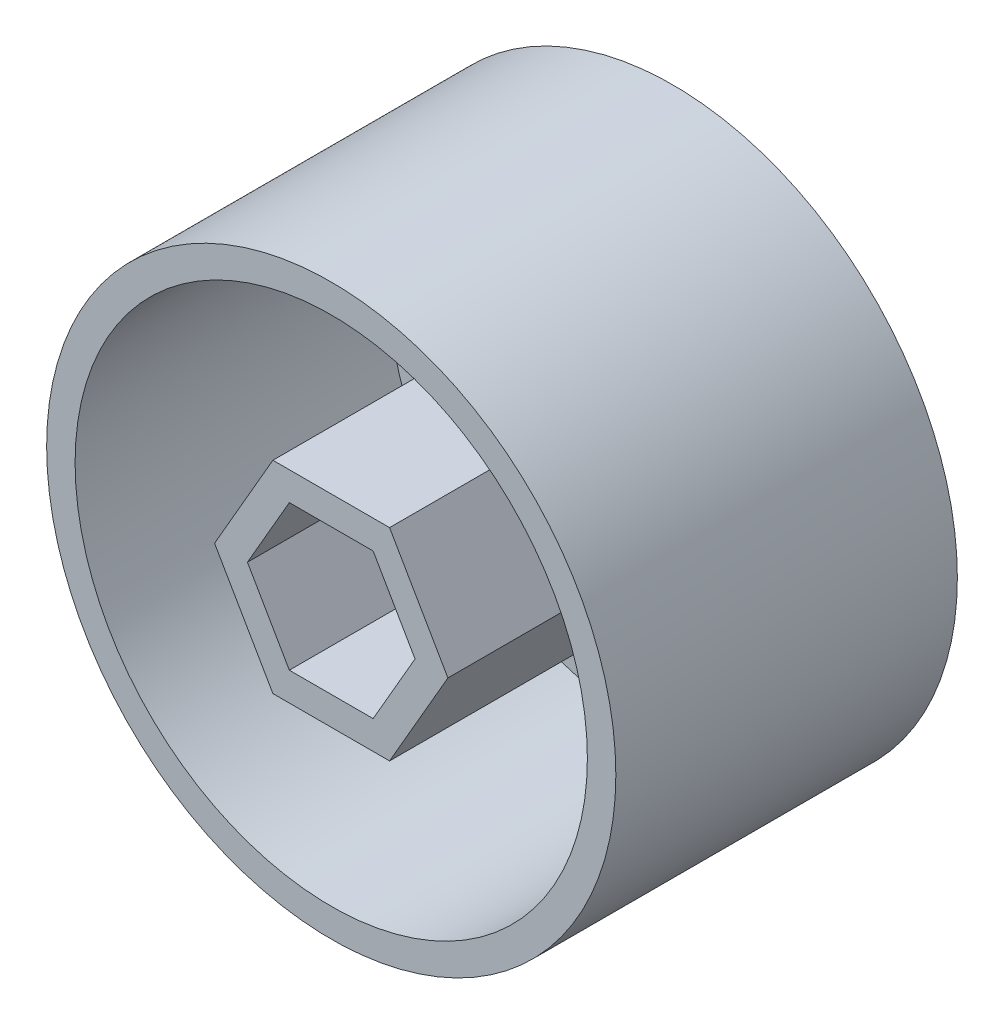
ISO-10303-21;
HEADER;
FILE_DESCRIPTION(('STEP AP214'),'2;1');
FILE_NAME('part.step','',(''),(''),'','','');
FILE_SCHEMA(('AUTOMOTIVE_DESIGN { 1 0 10303 214 1 1 1 1 }'));
ENDSEC;
DATA;
#1=APPLICATION_CONTEXT('core data for automotive mechanical design processes');
#2=APPLICATION_PROTOCOL_DEFINITION('international standard','automotive_design',2000,#1);
#3=PRODUCT_CONTEXT('',#1,'mechanical');
#4=PRODUCT('Part','Part','',(#3));
#5=PRODUCT_RELATED_PRODUCT_CATEGORY('part','',(#4));
#6=PRODUCT_DEFINITION_FORMATION('','',#4);
#7=PRODUCT_DEFINITION_CONTEXT('part definition',#1,'design');
#8=PRODUCT_DEFINITION('design','',#6,#7);
#9=PRODUCT_DEFINITION_SHAPE('','',#8);
#10=(LENGTH_UNIT() NAMED_UNIT(*) SI_UNIT(.MILLI.,.METRE.));
#11=(NAMED_UNIT(*) PLANE_ANGLE_UNIT() SI_UNIT($,.RADIAN.));
#12=(NAMED_UNIT(*) SI_UNIT($,.STERADIAN.) SOLID_ANGLE_UNIT());
#13=UNCERTAINTY_MEASURE_WITH_UNIT(LENGTH_MEASURE(1.E-05),#10,'distance_accuracy_value','');
#14=(GEOMETRIC_REPRESENTATION_CONTEXT(3) GLOBAL_UNCERTAINTY_ASSIGNED_CONTEXT((#13)) GLOBAL_UNIT_ASSIGNED_CONTEXT((#10,
#11,#12)) REPRESENTATION_CONTEXT('',''));
#15=CARTESIAN_POINT('',(0.,0.,0.));
#16=DIRECTION('',(0.,0.,1.));
#17=DIRECTION('',(1.,0.,0.));
#18=AXIS2_PLACEMENT_3D('',#15,#16,#17);
#19=CARTESIAN_POINT('',(0.,0.,2.));
#20=DIRECTION('',(0.,0.,-1.));
#21=DIRECTION('',(-1.,0.,0.));
#22=AXIS2_PLACEMENT_3D('',#19,#20,#21);
#23=PLANE('',#22);
#24=CARTESIAN_POINT('',(0.,0.,2.));
#25=DIRECTION('',(0.,0.,-1.));
#26=DIRECTION('',(-1.,0.,0.));
#27=AXIS2_PLACEMENT_3D('',#24,#25,#26);
#28=CIRCLE('',#27,18.);
#29=CARTESIAN_POINT('',(-18.,0.,2.));
#30=VERTEX_POINT('',#29);
#31=EDGE_CURVE('E231',#30,#30,#28,.T.);
#32=ORIENTED_EDGE('',*,*,#31,.F.);
#33=EDGE_LOOP('',(#32));
#34=FACE_BOUND('',#33,.T.);
#35=DIRECTION('',(0.5,0.866025403784439,0.));
#36=VECTOR('',#35,1.);
#37=CARTESIAN_POINT('',(6.14878036686952,-3.55,2.));
#38=LINE('',#37,#36);
#39=CARTESIAN_POINT('',(4.09918691124635,-7.1,2.));
#40=VERTEX_POINT('',#39);
#41=CARTESIAN_POINT('',(8.19837382249269,0.,2.));
#42=VERTEX_POINT('',#41);
#43=EDGE_CURVE('E12',#40,#42,#38,.T.);
#44=ORIENTED_EDGE('',*,*,#43,.F.);
#45=DIRECTION('',(1.,0.,0.));
#46=VECTOR('',#45,1.);
#47=CARTESIAN_POINT('',(0.,-7.1,2.));
#48=LINE('',#47,#46);
#49=CARTESIAN_POINT('',(-4.09918691124634,-7.1,2.));
#50=VERTEX_POINT('',#49);
#51=EDGE_CURVE('E247',#50,#40,#48,.T.);
#52=ORIENTED_EDGE('',*,*,#51,.F.);
#53=DIRECTION('',(0.5,-0.866025403784439,0.));
#54=VECTOR('',#53,1.);
#55=CARTESIAN_POINT('',(-6.14878036686951,-3.55,2.));
#56=LINE('',#55,#54);
#57=CARTESIAN_POINT('',(-8.19837382249269,0.,2.));
#58=VERTEX_POINT('',#57);
#59=EDGE_CURVE('E252',#58,#50,#56,.T.);
#60=ORIENTED_EDGE('',*,*,#59,.F.);
#61=DIRECTION('',(-0.5,-0.866025403784439,0.));
#62=VECTOR('',#61,1.);
#63=CARTESIAN_POINT('',(-6.14878036686951,3.55,2.));
#64=LINE('',#63,#62);
#65=CARTESIAN_POINT('',(-4.09918691124634,7.1,2.));
#66=VERTEX_POINT('',#65);
#67=EDGE_CURVE('E255',#66,#58,#64,.T.);
#68=ORIENTED_EDGE('',*,*,#67,.F.);
#69=DIRECTION('',(-1.,0.,0.));
#70=VECTOR('',#69,1.);
#71=CARTESIAN_POINT('',(0.,7.1,2.));
#72=LINE('',#71,#70);
#73=CARTESIAN_POINT('',(4.09918691124634,7.1,2.));
#74=VERTEX_POINT('',#73);
#75=EDGE_CURVE('E79',#74,#66,#72,.T.);
#76=ORIENTED_EDGE('',*,*,#75,.F.);
#77=DIRECTION('',(-0.5,0.866025403784439,0.));
#78=VECTOR('',#77,1.);
#79=CARTESIAN_POINT('',(6.14878036686951,3.55,2.));
#80=LINE('',#79,#78);
#81=EDGE_CURVE('E69',#42,#74,#80,.T.);
#82=ORIENTED_EDGE('',*,*,#81,.F.);
#83=EDGE_LOOP('',(#44,#52,#60,#68,#76,#82));
#84=FACE_BOUND('',#83,.T.);
#85=ADVANCED_FACE('F61',(#34,#84),#23,.F.);
#86=CARTESIAN_POINT('',(0.,0.,24.));
#87=DIRECTION('',(0.,0.,-1.));
#88=DIRECTION('',(-1.,0.,0.));
#89=AXIS2_PLACEMENT_3D('',#86,#87,#88);
#90=CYLINDRICAL_SURFACE('',#89,18.);
#91=CARTESIAN_POINT('',(0.,0.,24.));
#92=DIRECTION('',(0.,0.,1.));
#93=DIRECTION('',(1.,0.,0.));
#94=AXIS2_PLACEMENT_3D('',#91,#92,#93);
#95=CIRCLE('',#94,18.);
#96=CARTESIAN_POINT('',(18.,0.,24.));
#97=VERTEX_POINT('',#96);
#98=EDGE_CURVE('E241',#97,#97,#95,.T.);
#99=ORIENTED_EDGE('',*,*,#98,.T.);
#100=EDGE_LOOP('',(#99));
#101=FACE_BOUND('',#100,.T.);
#102=ORIENTED_EDGE('',*,*,#31,.T.);
#103=EDGE_LOOP('',(#102));
#104=FACE_BOUND('',#103,.T.);
#105=ADVANCED_FACE('F63',(#101,#104),#90,.F.);
#106=CARTESIAN_POINT('',(0.,0.,24.));
#107=DIRECTION('',(0.,0.,-1.));
#108=DIRECTION('',(-1.,0.,0.));
#109=AXIS2_PLACEMENT_3D('',#106,#107,#108);
#110=CYLINDRICAL_SURFACE('',#109,20.);
#111=CARTESIAN_POINT('',(0.,0.,0.));
#112=DIRECTION('',(0.,0.,1.));
#113=DIRECTION('',(1.,0.,0.));
#114=AXIS2_PLACEMENT_3D('',#111,#112,#113);
#115=CIRCLE('',#114,20.);
#116=CARTESIAN_POINT('',(20.,0.,0.));
#117=VERTEX_POINT('',#116);
#118=EDGE_CURVE('E240',#117,#117,#115,.T.);
#119=ORIENTED_EDGE('',*,*,#118,.T.);
#120=EDGE_LOOP('',(#119));
#121=FACE_BOUND('',#120,.T.);
#122=CARTESIAN_POINT('',(0.,0.,24.));
#123=DIRECTION('',(0.,0.,1.));
#124=DIRECTION('',(1.,0.,0.));
#125=AXIS2_PLACEMENT_3D('',#122,#123,#124);
#126=CIRCLE('',#125,20.);
#127=CARTESIAN_POINT('',(20.,0.,24.));
#128=VERTEX_POINT('',#127);
#129=EDGE_CURVE('E244',#128,#128,#126,.T.);
#130=ORIENTED_EDGE('',*,*,#129,.F.);
#131=EDGE_LOOP('',(#130));
#132=FACE_BOUND('',#131,.T.);
#133=ADVANCED_FACE('F295',(#121,#132),#110,.T.);
#134=CARTESIAN_POINT('',(0.,0.,24.));
#135=DIRECTION('',(0.,0.,1.));
#136=DIRECTION('',(1.,0.,0.));
#137=AXIS2_PLACEMENT_3D('',#134,#135,#136);
#138=PLANE('',#137);
#139=ORIENTED_EDGE('',*,*,#98,.F.);
#140=EDGE_LOOP('',(#139));
#141=FACE_BOUND('',#140,.T.);
#142=ORIENTED_EDGE('',*,*,#129,.T.);
#143=EDGE_LOOP('',(#142));
#144=FACE_BOUND('',#143,.T.);
#145=ADVANCED_FACE('F302',(#141,#144),#138,.T.);
#146=CARTESIAN_POINT('',(0.,0.,0.));
#147=DIRECTION('',(0.,0.,1.));
#148=DIRECTION('',(1.,0.,0.));
#149=AXIS2_PLACEMENT_3D('',#146,#147,#148);
#150=PLANE('',#149);
#151=DIRECTION('',(1.,0.,0.));
#152=VECTOR('',#151,1.);
#153=CARTESIAN_POINT('',(2.94448637286709,5.1,0.));
#154=LINE('',#153,#152);
#155=CARTESIAN_POINT('',(-2.94448637286709,5.1,0.));
#156=VERTEX_POINT('',#155);
#157=CARTESIAN_POINT('',(2.94448637286709,5.1,0.));
#158=VERTEX_POINT('',#157);
#159=EDGE_CURVE('E214',#156,#158,#154,.T.);
#160=ORIENTED_EDGE('',*,*,#159,.F.);
#161=DIRECTION('',(0.5,0.866025403784439,0.));
#162=VECTOR('',#161,1.);
#163=CARTESIAN_POINT('',(-2.94448637286709,5.1,0.));
#164=LINE('',#163,#162);
#165=CARTESIAN_POINT('',(-5.88897274573418,0.,0.));
#166=VERTEX_POINT('',#165);
#167=EDGE_CURVE('E225',#166,#156,#164,.T.);
#168=ORIENTED_EDGE('',*,*,#167,.F.);
#169=DIRECTION('',(-0.5,0.866025403784438,0.));
#170=VECTOR('',#169,1.);
#171=CARTESIAN_POINT('',(-5.88897274573418,0.,0.));
#172=LINE('',#171,#170);
#173=CARTESIAN_POINT('',(-2.94448637286709,-5.1,0.));
#174=VERTEX_POINT('',#173);
#175=EDGE_CURVE('E222',#174,#166,#172,.T.);
#176=ORIENTED_EDGE('',*,*,#175,.F.);
#177=DIRECTION('',(-1.,0.,0.));
#178=VECTOR('',#177,1.);
#179=CARTESIAN_POINT('',(-2.94448637286709,-5.1,0.));
#180=LINE('',#179,#178);
#181=CARTESIAN_POINT('',(2.94448637286709,-5.1,0.));
#182=VERTEX_POINT('',#181);
#183=EDGE_CURVE('E220',#182,#174,#180,.T.);
#184=ORIENTED_EDGE('',*,*,#183,.F.);
#185=DIRECTION('',(-0.5,-0.866025403784439,0.));
#186=VECTOR('',#185,1.);
#187=CARTESIAN_POINT('',(2.94448637286709,-5.1,0.));
#188=LINE('',#187,#186);
#189=CARTESIAN_POINT('',(5.88897274573418,0.,0.));
#190=VERTEX_POINT('',#189);
#191=EDGE_CURVE('E152',#190,#182,#188,.T.);
#192=ORIENTED_EDGE('',*,*,#191,.F.);
#193=DIRECTION('',(0.5,-0.866025403784438,0.));
#194=VECTOR('',#193,1.);
#195=CARTESIAN_POINT('',(5.88897274573418,0.,0.));
#196=LINE('',#195,#194);
#197=EDGE_CURVE('E216',#158,#190,#196,.T.);
#198=ORIENTED_EDGE('',*,*,#197,.F.);
#199=EDGE_LOOP('',(#160,#168,#176,#184,#192,#198));
#200=FACE_BOUND('',#199,.T.);
#201=ORIENTED_EDGE('',*,*,#118,.F.);
#202=EDGE_LOOP('',(#201));
#203=FACE_BOUND('',#202,.T.);
#204=ADVANCED_FACE('F305',(#200,#203),#150,.F.);
#205=CARTESIAN_POINT('',(2.94448637286709,5.1,2.));
#206=DIRECTION('',(0.,1.,0.));
#207=DIRECTION('',(0.,0.,1.));
#208=AXIS2_PLACEMENT_3D('',#205,#206,#207);
#209=PLANE('',#208);
#210=ORIENTED_EDGE('',*,*,#159,.T.);
#211=DIRECTION('',(0.,0.,-1.));
#212=VECTOR('',#211,1.);
#213=CARTESIAN_POINT('',(2.94448637286709,5.1,2.));
#214=LINE('',#213,#212);
#215=CARTESIAN_POINT('',(2.94448637286709,5.1,24.));
#216=VERTEX_POINT('',#215);
#217=EDGE_CURVE('E228',#216,#158,#214,.T.);
#218=ORIENTED_EDGE('',*,*,#217,.F.);
#219=DIRECTION('',(-1.,0.,0.));
#220=VECTOR('',#219,1.);
#221=CARTESIAN_POINT('',(0.,5.1,24.));
#222=LINE('',#221,#220);
#223=CARTESIAN_POINT('',(-2.94448637286709,5.1,24.));
#224=VERTEX_POINT('',#223);
#225=EDGE_CURVE('E179',#216,#224,#222,.T.);
#226=ORIENTED_EDGE('',*,*,#225,.T.);
#227=DIRECTION('',(0.,0.,-1.));
#228=VECTOR('',#227,1.);
#229=CARTESIAN_POINT('',(-2.94448637286709,5.1,2.));
#230=LINE('',#229,#228);
#231=EDGE_CURVE('E229',#224,#156,#230,.T.);
#232=ORIENTED_EDGE('',*,*,#231,.T.);
#233=EDGE_LOOP('',(#210,#218,#226,#232));
#234=FACE_BOUND('',#233,.T.);
#235=ADVANCED_FACE('F300',(#234),#209,.F.);
#236=CARTESIAN_POINT('',(-2.94448637286709,5.1,2.));
#237=DIRECTION('',(-0.866025403784439,0.5,0.));
#238=DIRECTION('',(-0.5,-0.866025403784439,0.));
#239=AXIS2_PLACEMENT_3D('',#236,#237,#238);
#240=PLANE('',#239);
#241=ORIENTED_EDGE('',*,*,#167,.T.);
#242=ORIENTED_EDGE('',*,*,#231,.F.);
#243=DIRECTION('',(-0.5,-0.866025403784439,0.));
#244=VECTOR('',#243,1.);
#245=CARTESIAN_POINT('',(-4.41672955930064,2.55,24.));
#246=LINE('',#245,#244);
#247=CARTESIAN_POINT('',(-5.88897274573418,0.,24.));
#248=VERTEX_POINT('',#247);
#249=EDGE_CURVE('E174',#224,#248,#246,.T.);
#250=ORIENTED_EDGE('',*,*,#249,.T.);
#251=DIRECTION('',(0.,0.,-1.));
#252=VECTOR('',#251,1.);
#253=CARTESIAN_POINT('',(-5.88897274573418,0.,2.));
#254=LINE('',#253,#252);
#255=EDGE_CURVE('E232',#248,#166,#254,.T.);
#256=ORIENTED_EDGE('',*,*,#255,.T.);
#257=EDGE_LOOP('',(#241,#242,#250,#256));
#258=FACE_BOUND('',#257,.T.);
#259=ADVANCED_FACE('F334',(#258),#240,.F.);
#260=CARTESIAN_POINT('',(-5.88897274573418,0.,2.));
#261=DIRECTION('',(-0.866025403784438,-0.5,0.));
#262=DIRECTION('',(0.5,-0.866025403784438,0.));
#263=AXIS2_PLACEMENT_3D('',#260,#261,#262);
#264=PLANE('',#263);
#265=ORIENTED_EDGE('',*,*,#175,.T.);
#266=ORIENTED_EDGE('',*,*,#255,.F.);
#267=DIRECTION('',(0.5,-0.866025403784439,0.));
#268=VECTOR('',#267,1.);
#269=CARTESIAN_POINT('',(-4.41672955930063,-2.55,24.));
#270=LINE('',#269,#268);
#271=CARTESIAN_POINT('',(-2.94448637286709,-5.1,24.));
#272=VERTEX_POINT('',#271);
#273=EDGE_CURVE('E172',#248,#272,#270,.T.);
#274=ORIENTED_EDGE('',*,*,#273,.T.);
#275=DIRECTION('',(0.,0.,-1.));
#276=VECTOR('',#275,1.);
#277=CARTESIAN_POINT('',(-2.94448637286709,-5.1,2.));
#278=LINE('',#277,#276);
#279=EDGE_CURVE('E157',#272,#174,#278,.T.);
#280=ORIENTED_EDGE('',*,*,#279,.T.);
#281=EDGE_LOOP('',(#265,#266,#274,#280));
#282=FACE_BOUND('',#281,.T.);
#283=ADVANCED_FACE('F341',(#282),#264,.F.);
#284=CARTESIAN_POINT('',(-2.94448637286709,-5.1,2.));
#285=DIRECTION('',(0.,-1.,0.));
#286=DIRECTION('',(1.,0.,0.));
#287=AXIS2_PLACEMENT_3D('',#284,#285,#286);
#288=PLANE('',#287);
#289=ORIENTED_EDGE('',*,*,#183,.T.);
#290=ORIENTED_EDGE('',*,*,#279,.F.);
#291=DIRECTION('',(1.,0.,0.));
#292=VECTOR('',#291,1.);
#293=CARTESIAN_POINT('',(0.,-5.1,24.));
#294=LINE('',#293,#292);
#295=CARTESIAN_POINT('',(2.94448637286709,-5.1,24.));
#296=VERTEX_POINT('',#295);
#297=EDGE_CURVE('E165',#272,#296,#294,.T.);
#298=ORIENTED_EDGE('',*,*,#297,.T.);
#299=DIRECTION('',(0.,0.,-1.));
#300=VECTOR('',#299,1.);
#301=CARTESIAN_POINT('',(2.94448637286709,-5.1,2.));
#302=LINE('',#301,#300);
#303=EDGE_CURVE('E146',#296,#182,#302,.T.);
#304=ORIENTED_EDGE('',*,*,#303,.T.);
#305=EDGE_LOOP('',(#289,#290,#298,#304));
#306=FACE_BOUND('',#305,.T.);
#307=ADVANCED_FACE('F171',(#306),#288,.F.);
#308=CARTESIAN_POINT('',(2.94448637286709,-5.1,2.));
#309=DIRECTION('',(0.866025403784439,-0.5,0.));
#310=DIRECTION('',(0.5,0.866025403784439,0.));
#311=AXIS2_PLACEMENT_3D('',#308,#309,#310);
#312=PLANE('',#311);
#313=ORIENTED_EDGE('',*,*,#191,.T.);
#314=ORIENTED_EDGE('',*,*,#303,.F.);
#315=DIRECTION('',(0.5,0.866025403784439,0.));
#316=VECTOR('',#315,1.);
#317=CARTESIAN_POINT('',(4.41672955930064,-2.55,24.));
#318=LINE('',#317,#316);
#319=CARTESIAN_POINT('',(5.88897274573418,0.,24.));
#320=VERTEX_POINT('',#319);
#321=EDGE_CURVE('E149',#296,#320,#318,.T.);
#322=ORIENTED_EDGE('',*,*,#321,.T.);
#323=DIRECTION('',(0.,0.,-1.));
#324=VECTOR('',#323,1.);
#325=CARTESIAN_POINT('',(5.88897274573418,0.,2.));
#326=LINE('',#325,#324);
#327=EDGE_CURVE('E158',#320,#190,#326,.T.);
#328=ORIENTED_EDGE('',*,*,#327,.T.);
#329=EDGE_LOOP('',(#313,#314,#322,#328));
#330=FACE_BOUND('',#329,.T.);
#331=ADVANCED_FACE('F148',(#330),#312,.F.);
#332=CARTESIAN_POINT('',(5.88897274573418,0.,2.));
#333=DIRECTION('',(0.866025403784438,0.5,0.));
#334=DIRECTION('',(-0.5,0.866025403784439,0.));
#335=AXIS2_PLACEMENT_3D('',#332,#333,#334);
#336=PLANE('',#335);
#337=ORIENTED_EDGE('',*,*,#197,.T.);
#338=ORIENTED_EDGE('',*,*,#327,.F.);
#339=DIRECTION('',(-0.5,0.866025403784439,0.));
#340=VECTOR('',#339,1.);
#341=CARTESIAN_POINT('',(4.41672955930064,2.55,24.));
#342=LINE('',#341,#340);
#343=EDGE_CURVE('E169',#320,#216,#342,.T.);
#344=ORIENTED_EDGE('',*,*,#343,.T.);
#345=ORIENTED_EDGE('',*,*,#217,.T.);
#346=EDGE_LOOP('',(#337,#338,#344,#345));
#347=FACE_BOUND('',#346,.T.);
#348=ADVANCED_FACE('F362',(#347),#336,.F.);
#349=CARTESIAN_POINT('',(6.14878036686952,-3.55,24.));
#350=DIRECTION('',(-0.866025403784439,0.5,0.));
#351=DIRECTION('',(-0.5,-0.866025403784439,0.));
#352=AXIS2_PLACEMENT_3D('',#349,#350,#351);
#353=PLANE('',#352);
#354=DIRECTION('',(0.,0.,-1.));
#355=VECTOR('',#354,1.);
#356=CARTESIAN_POINT('',(4.09918691124635,-7.1,24.));
#357=LINE('',#356,#355);
#358=CARTESIAN_POINT('',(4.09918691124635,-7.1,24.));
#359=VERTEX_POINT('',#358);
#360=EDGE_CURVE('E196',#359,#40,#357,.T.);
#361=ORIENTED_EDGE('',*,*,#360,.T.);
#362=ORIENTED_EDGE('',*,*,#43,.T.);
#363=DIRECTION('',(0.,0.,-1.));
#364=VECTOR('',#363,1.);
#365=CARTESIAN_POINT('',(8.19837382249269,0.,24.));
#366=LINE('',#365,#364);
#367=CARTESIAN_POINT('',(8.19837382249269,0.,24.));
#368=VERTEX_POINT('',#367);
#369=EDGE_CURVE('E211',#368,#42,#366,.T.);
#370=ORIENTED_EDGE('',*,*,#369,.F.);
#371=DIRECTION('',(0.5,0.866025403784439,0.));
#372=VECTOR('',#371,1.);
#373=CARTESIAN_POINT('',(6.14878036686952,-3.55,24.));
#374=LINE('',#373,#372);
#375=EDGE_CURVE('E183',#359,#368,#374,.T.);
#376=ORIENTED_EDGE('',*,*,#375,.F.);
#377=EDGE_LOOP('',(#361,#362,#370,#376));
#378=FACE_BOUND('',#377,.T.);
#379=ADVANCED_FACE('F272',(#378),#353,.F.);
#380=CARTESIAN_POINT('',(6.14878036686951,3.55,24.));
#381=DIRECTION('',(-0.866025403784439,-0.5,0.));
#382=DIRECTION('',(0.5,-0.866025403784439,0.));
#383=AXIS2_PLACEMENT_3D('',#380,#381,#382);
#384=PLANE('',#383);
#385=ORIENTED_EDGE('',*,*,#369,.T.);
#386=ORIENTED_EDGE('',*,*,#81,.T.);
#387=DIRECTION('',(0.,0.,-1.));
#388=VECTOR('',#387,1.);
#389=CARTESIAN_POINT('',(4.09918691124634,7.1,24.));
#390=LINE('',#389,#388);
#391=CARTESIAN_POINT('',(4.09918691124634,7.1,24.));
#392=VERTEX_POINT('',#391);
#393=EDGE_CURVE('E208',#392,#74,#390,.T.);
#394=ORIENTED_EDGE('',*,*,#393,.F.);
#395=DIRECTION('',(-0.5,0.866025403784439,0.));
#396=VECTOR('',#395,1.);
#397=CARTESIAN_POINT('',(6.14878036686951,3.55,24.));
#398=LINE('',#397,#396);
#399=EDGE_CURVE('E186',#368,#392,#398,.T.);
#400=ORIENTED_EDGE('',*,*,#399,.F.);
#401=EDGE_LOOP('',(#385,#386,#394,#400));
#402=FACE_BOUND('',#401,.T.);
#403=ADVANCED_FACE('F260',(#402),#384,.F.);
#404=CARTESIAN_POINT('',(0.,7.1,24.));
#405=DIRECTION('',(0.,-1.,0.));
#406=DIRECTION('',(1.,0.,0.));
#407=AXIS2_PLACEMENT_3D('',#404,#405,#406);
#408=PLANE('',#407);
#409=ORIENTED_EDGE('',*,*,#393,.T.);
#410=ORIENTED_EDGE('',*,*,#75,.T.);
#411=DIRECTION('',(0.,0.,-1.));
#412=VECTOR('',#411,1.);
#413=CARTESIAN_POINT('',(-4.09918691124634,7.1,24.));
#414=LINE('',#413,#412);
#415=CARTESIAN_POINT('',(-4.09918691124634,7.1,24.));
#416=VERTEX_POINT('',#415);
#417=EDGE_CURVE('E205',#416,#66,#414,.T.);
#418=ORIENTED_EDGE('',*,*,#417,.F.);
#419=DIRECTION('',(-1.,0.,0.));
#420=VECTOR('',#419,1.);
#421=CARTESIAN_POINT('',(0.,7.1,24.));
#422=LINE('',#421,#420);
#423=EDGE_CURVE('E188',#392,#416,#422,.T.);
#424=ORIENTED_EDGE('',*,*,#423,.F.);
#425=EDGE_LOOP('',(#409,#410,#418,#424));
#426=FACE_BOUND('',#425,.T.);
#427=ADVANCED_FACE('F264',(#426),#408,.F.);
#428=CARTESIAN_POINT('',(-6.14878036686952,3.55,24.));
#429=DIRECTION('',(0.866025403784439,-0.5,0.));
#430=DIRECTION('',(0.5,0.866025403784439,0.));
#431=AXIS2_PLACEMENT_3D('',#428,#429,#430);
#432=PLANE('',#431);
#433=ORIENTED_EDGE('',*,*,#417,.T.);
#434=ORIENTED_EDGE('',*,*,#67,.T.);
#435=DIRECTION('',(0.,0.,-1.));
#436=VECTOR('',#435,1.);
#437=CARTESIAN_POINT('',(-8.19837382249268,0.,24.));
#438=LINE('',#437,#436);
#439=CARTESIAN_POINT('',(-8.19837382249268,0.,24.));
#440=VERTEX_POINT('',#439);
#441=EDGE_CURVE('E202',#440,#58,#438,.T.);
#442=ORIENTED_EDGE('',*,*,#441,.F.);
#443=DIRECTION('',(-0.5,-0.866025403784439,0.));
#444=VECTOR('',#443,1.);
#445=CARTESIAN_POINT('',(-6.14878036686952,3.55,24.));
#446=LINE('',#445,#444);
#447=EDGE_CURVE('E190',#416,#440,#446,.T.);
#448=ORIENTED_EDGE('',*,*,#447,.F.);
#449=EDGE_LOOP('',(#433,#434,#442,#448));
#450=FACE_BOUND('',#449,.T.);
#451=ADVANCED_FACE('F280',(#450),#432,.F.);
#452=CARTESIAN_POINT('',(-6.14878036686951,-3.55,24.));
#453=DIRECTION('',(0.866025403784439,0.5,0.));
#454=DIRECTION('',(-0.5,0.866025403784439,0.));
#455=AXIS2_PLACEMENT_3D('',#452,#453,#454);
#456=PLANE('',#455);
#457=ORIENTED_EDGE('',*,*,#441,.T.);
#458=ORIENTED_EDGE('',*,*,#59,.T.);
#459=DIRECTION('',(0.,0.,-1.));
#460=VECTOR('',#459,1.);
#461=CARTESIAN_POINT('',(-4.09918691124634,-7.1,24.));
#462=LINE('',#461,#460);
#463=CARTESIAN_POINT('',(-4.09918691124634,-7.1,24.));
#464=VERTEX_POINT('',#463);
#465=EDGE_CURVE('E199',#464,#50,#462,.T.);
#466=ORIENTED_EDGE('',*,*,#465,.F.);
#467=DIRECTION('',(0.5,-0.866025403784439,0.));
#468=VECTOR('',#467,1.);
#469=CARTESIAN_POINT('',(-6.14878036686951,-3.55,24.));
#470=LINE('',#469,#468);
#471=EDGE_CURVE('E192',#440,#464,#470,.T.);
#472=ORIENTED_EDGE('',*,*,#471,.F.);
#473=EDGE_LOOP('',(#457,#458,#466,#472));
#474=FACE_BOUND('',#473,.T.);
#475=ADVANCED_FACE('F278',(#474),#456,.F.);
#476=CARTESIAN_POINT('',(0.,-7.1,24.));
#477=DIRECTION('',(0.,1.,0.));
#478=DIRECTION('',(-1.,0.,0.));
#479=AXIS2_PLACEMENT_3D('',#476,#477,#478);
#480=PLANE('',#479);
#481=ORIENTED_EDGE('',*,*,#465,.T.);
#482=ORIENTED_EDGE('',*,*,#51,.T.);
#483=ORIENTED_EDGE('',*,*,#360,.F.);
#484=DIRECTION('',(1.,0.,0.));
#485=VECTOR('',#484,1.);
#486=CARTESIAN_POINT('',(0.,-7.1,24.));
#487=LINE('',#486,#485);
#488=EDGE_CURVE('E194',#464,#359,#487,.T.);
#489=ORIENTED_EDGE('',*,*,#488,.F.);
#490=EDGE_LOOP('',(#481,#482,#483,#489));
#491=FACE_BOUND('',#490,.T.);
#492=ADVANCED_FACE('F274',(#491),#480,.F.);
#493=CARTESIAN_POINT('',(0.,0.,24.));
#494=DIRECTION('',(0.,0.,1.));
#495=DIRECTION('',(1.,0.,0.));
#496=AXIS2_PLACEMENT_3D('',#493,#494,#495);
#497=PLANE('',#496);
#498=ORIENTED_EDGE('',*,*,#321,.F.);
#499=ORIENTED_EDGE('',*,*,#297,.F.);
#500=ORIENTED_EDGE('',*,*,#273,.F.);
#501=ORIENTED_EDGE('',*,*,#249,.F.);
#502=ORIENTED_EDGE('',*,*,#225,.F.);
#503=ORIENTED_EDGE('',*,*,#343,.F.);
#504=EDGE_LOOP('',(#498,#499,#500,#501,#502,#503));
#505=FACE_BOUND('',#504,.T.);
#506=ORIENTED_EDGE('',*,*,#375,.T.);
#507=ORIENTED_EDGE('',*,*,#399,.T.);
#508=ORIENTED_EDGE('',*,*,#423,.T.);
#509=ORIENTED_EDGE('',*,*,#447,.T.);
#510=ORIENTED_EDGE('',*,*,#471,.T.);
#511=ORIENTED_EDGE('',*,*,#488,.T.);
#512=EDGE_LOOP('',(#506,#507,#508,#509,#510,#511));
#513=FACE_BOUND('',#512,.T.);
#514=ADVANCED_FACE('F162',(#505,#513),#497,.T.);
#515=CLOSED_SHELL('',(#85,#105,#133,#145,#204,#235,#259,#283,#307,#331,#348,#379,#403,#427,#451,
#475,#492,#514));
#516=MANIFOLD_SOLID_BREP('B2',#515);
#517=ADVANCED_BREP_SHAPE_REPRESENTATION('',(#18,#516),#14);
#518=SHAPE_DEFINITION_REPRESENTATION(#9,#517);
ENDSEC;
END-ISO-10303-21;
